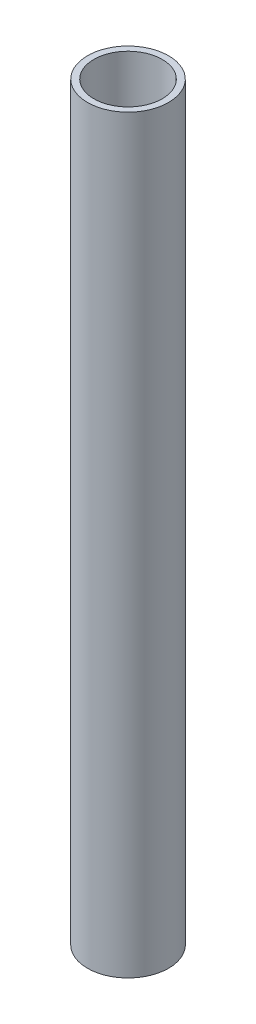
ISO-10303-21;
HEADER;
FILE_DESCRIPTION(('STEP AP214'),'2;1');
FILE_NAME('part.step','',(''),(''),'','','');
FILE_SCHEMA(('AUTOMOTIVE_DESIGN { 1 0 10303 214 1 1 1 1 }'));
ENDSEC;
DATA;
#1=APPLICATION_CONTEXT('core data for automotive mechanical design processes');
#2=APPLICATION_PROTOCOL_DEFINITION('international standard','automotive_design',2000,#1);
#3=PRODUCT_CONTEXT('',#1,'mechanical');
#4=PRODUCT('Part','Part','',(#3));
#5=PRODUCT_RELATED_PRODUCT_CATEGORY('part','',(#4));
#6=PRODUCT_DEFINITION_FORMATION('','',#4);
#7=PRODUCT_DEFINITION_CONTEXT('part definition',#1,'design');
#8=PRODUCT_DEFINITION('design','',#6,#7);
#9=PRODUCT_DEFINITION_SHAPE('','',#8);
#10=(LENGTH_UNIT() NAMED_UNIT(*) SI_UNIT(.MILLI.,.METRE.));
#11=(NAMED_UNIT(*) PLANE_ANGLE_UNIT() SI_UNIT($,.RADIAN.));
#12=(NAMED_UNIT(*) SI_UNIT($,.STERADIAN.) SOLID_ANGLE_UNIT());
#13=UNCERTAINTY_MEASURE_WITH_UNIT(LENGTH_MEASURE(1.E-05),#10,'distance_accuracy_value','');
#14=(GEOMETRIC_REPRESENTATION_CONTEXT(3) GLOBAL_UNCERTAINTY_ASSIGNED_CONTEXT((#13)) GLOBAL_UNIT_ASSIGNED_CONTEXT((#10,
#11,#12)) REPRESENTATION_CONTEXT('',''));
#15=CARTESIAN_POINT('',(0.,0.,0.));
#16=DIRECTION('',(0.,0.,1.));
#17=DIRECTION('',(1.,0.,0.));
#18=AXIS2_PLACEMENT_3D('',#15,#16,#17);
#19=CARTESIAN_POINT('',(-3.35359457523393E-13,329.664587481053,789.774999999999));
#20=DIRECTION('',(0.,1.,0.));
#21=DIRECTION('',(-1.,0.,0.));
#22=AXIS2_PLACEMENT_3D('',#19,#20,#21);
#23=PLANE('',#22);
#24=CARTESIAN_POINT('',(-3.35359457523393E-13,329.664587481053,789.774999999999));
#25=DIRECTION('',(0.,1.,0.));
#26=DIRECTION('',(-1.,0.,0.));
#27=AXIS2_PLACEMENT_3D('',#24,#25,#26);
#28=CIRCLE('',#27,7.93750000000001);
#29=CARTESIAN_POINT('',(7.93749999999968,329.664587481053,789.774999999999));
#30=VERTEX_POINT('',#29);
#31=EDGE_CURVE('E10',#30,#30,#28,.T.);
#32=ORIENTED_EDGE('',*,*,#31,.T.);
#33=EDGE_LOOP('',(#32));
#34=FACE_BOUND('',#33,.T.);
#35=CARTESIAN_POINT('',(-3.35359457523393E-13,329.664587481053,789.774999999999));
#36=DIRECTION('',(0.,1.,0.));
#37=DIRECTION('',(-1.,0.,0.));
#38=AXIS2_PLACEMENT_3D('',#35,#36,#37);
#39=CIRCLE('',#38,6.6929);
#40=CARTESIAN_POINT('',(6.69289999999967,329.664587481053,789.774999999999));
#41=VERTEX_POINT('',#40);
#42=EDGE_CURVE('E48',#41,#41,#39,.T.);
#43=ORIENTED_EDGE('',*,*,#42,.F.);
#44=EDGE_LOOP('',(#43));
#45=FACE_BOUND('',#44,.T.);
#46=ADVANCED_FACE('F37',(#34,#45),#23,.T.);
#47=CARTESIAN_POINT('',(0.,182.79,789.774999999999));
#48=DIRECTION('',(0.,1.,0.));
#49=DIRECTION('',(-1.,0.,0.));
#50=AXIS2_PLACEMENT_3D('',#47,#48,#49);
#51=PLANE('',#50);
#52=CARTESIAN_POINT('',(0.,182.79,789.774999999999));
#53=DIRECTION('',(0.,1.,0.));
#54=DIRECTION('',(-1.,0.,0.));
#55=AXIS2_PLACEMENT_3D('',#52,#53,#54);
#56=CIRCLE('',#55,7.93750000000001);
#57=CARTESIAN_POINT('',(7.93750000000003,182.79,789.774999999999));
#58=VERTEX_POINT('',#57);
#59=EDGE_CURVE('E41',#58,#58,#56,.T.);
#60=ORIENTED_EDGE('',*,*,#59,.F.);
#61=EDGE_LOOP('',(#60));
#62=FACE_BOUND('',#61,.T.);
#63=CARTESIAN_POINT('',(0.,182.79,789.774999999999));
#64=DIRECTION('',(0.,1.,0.));
#65=DIRECTION('',(-1.,0.,0.));
#66=AXIS2_PLACEMENT_3D('',#63,#64,#65);
#67=CIRCLE('',#66,6.6929);
#68=CARTESIAN_POINT('',(6.69290000000001,182.79,789.774999999999));
#69=VERTEX_POINT('',#68);
#70=EDGE_CURVE('E50',#69,#69,#67,.T.);
#71=ORIENTED_EDGE('',*,*,#70,.T.);
#72=EDGE_LOOP('',(#71));
#73=FACE_BOUND('',#72,.T.);
#74=ADVANCED_FACE('F60',(#62,#73),#51,.F.);
#75=CARTESIAN_POINT('',(-3.35359457523393E-13,329.664587481053,789.774999999999));
#76=DIRECTION('',(0.,-1.,0.));
#77=DIRECTION('',(1.,0.,0.));
#78=AXIS2_PLACEMENT_3D('',#75,#76,#77);
#79=CYLINDRICAL_SURFACE('',#78,7.93750000000001);
#80=CARTESIAN_POINT('',(7.93749999999968,329.664587481053,789.774999999999));
#81=CARTESIAN_POINT('',(7.93749999999968,328.134643861459,789.774999999999));
#82=CARTESIAN_POINT('',(7.93749999999969,326.604700241864,789.774999999999));
#83=CARTESIAN_POINT('',(7.93749999999969,323.544813002676,789.774999999999));
#84=CARTESIAN_POINT('',(7.9374999999997,322.014869383081,789.774999999999));
#85=CARTESIAN_POINT('',(7.9374999999997,318.954982143893,789.774999999999));
#86=CARTESIAN_POINT('',(7.93749999999971,317.425038524298,789.774999999999));
#87=CARTESIAN_POINT('',(7.93749999999972,314.36515128511,789.774999999999));
#88=CARTESIAN_POINT('',(7.93749999999972,312.835207665516,789.774999999999));
#89=CARTESIAN_POINT('',(7.93749999999973,309.775320426327,789.774999999999));
#90=CARTESIAN_POINT('',(7.93749999999973,308.245376806733,789.774999999999));
#91=CARTESIAN_POINT('',(7.93749999999974,305.185489567544,789.774999999999));
#92=CARTESIAN_POINT('',(7.93749999999974,303.65554594795,789.774999999999));
#93=CARTESIAN_POINT('',(7.93749999999975,300.595658708761,789.774999999999));
#94=CARTESIAN_POINT('',(7.93749999999975,299.065715089167,789.774999999999));
#95=CARTESIAN_POINT('',(7.93749999999976,296.005827849978,789.774999999999));
#96=CARTESIAN_POINT('',(7.93749999999976,294.475884230384,789.774999999999));
#97=CARTESIAN_POINT('',(7.93749999999977,291.415996991195,789.774999999999));
#98=CARTESIAN_POINT('',(7.93749999999977,289.886053371601,789.774999999999));
#99=CARTESIAN_POINT('',(7.93749999999978,286.826166132412,789.774999999999));
#100=CARTESIAN_POINT('',(7.93749999999978,285.296222512818,789.774999999999));
#101=CARTESIAN_POINT('',(7.93749999999979,282.23633527363,789.774999999999));
#102=CARTESIAN_POINT('',(7.9374999999998,280.706391654035,789.774999999999));
#103=CARTESIAN_POINT('',(7.9374999999998,277.646504414847,789.774999999999));
#104=CARTESIAN_POINT('',(7.93749999999981,276.116560795252,789.774999999999));
#105=CARTESIAN_POINT('',(7.93749999999981,273.056673556064,789.774999999999));
#106=CARTESIAN_POINT('',(7.93749999999982,271.526729936469,789.774999999999));
#107=CARTESIAN_POINT('',(7.93749999999982,268.466842697281,789.774999999999));
#108=CARTESIAN_POINT('',(7.93749999999983,266.936899077687,789.774999999999));
#109=CARTESIAN_POINT('',(7.93749999999983,263.877011838498,789.774999999999));
#110=CARTESIAN_POINT('',(7.93749999999984,262.347068218904,789.774999999999));
#111=CARTESIAN_POINT('',(7.93749999999985,259.287180979715,789.774999999999));
#112=CARTESIAN_POINT('',(7.93749999999985,257.757237360121,789.774999999999));
#113=CARTESIAN_POINT('',(7.93749999999986,254.697350120932,789.774999999999));
#114=CARTESIAN_POINT('',(7.93749999999986,253.167406501338,789.774999999999));
#115=CARTESIAN_POINT('',(7.93749999999987,250.107519262149,789.774999999999));
#116=CARTESIAN_POINT('',(7.93749999999987,248.577575642555,789.774999999999));
#117=CARTESIAN_POINT('',(7.93749999999988,245.517688403366,789.774999999999));
#118=CARTESIAN_POINT('',(7.93749999999988,243.987744783772,789.774999999999));
#119=CARTESIAN_POINT('',(7.93749999999989,240.927857544583,789.774999999999));
#120=CARTESIAN_POINT('',(7.93749999999989,239.397913924989,789.774999999999));
#121=CARTESIAN_POINT('',(7.9374999999999,236.338026685801,789.774999999999));
#122=CARTESIAN_POINT('',(7.9374999999999,234.808083066206,789.774999999999));
#123=CARTESIAN_POINT('',(7.93749999999991,231.748195827018,789.774999999999));
#124=CARTESIAN_POINT('',(7.93749999999991,230.218252207423,789.774999999999));
#125=CARTESIAN_POINT('',(7.93749999999992,227.158364968235,789.774999999999));
#126=CARTESIAN_POINT('',(7.93749999999993,225.62842134864,789.774999999999));
#127=CARTESIAN_POINT('',(7.93749999999993,222.568534109452,789.774999999999));
#128=CARTESIAN_POINT('',(7.93749999999994,221.038590489858,789.774999999999));
#129=CARTESIAN_POINT('',(7.93749999999994,217.978703250669,789.774999999999));
#130=CARTESIAN_POINT('',(7.93749999999995,216.448759631075,789.774999999999));
#131=CARTESIAN_POINT('',(7.93749999999995,213.388872391886,789.774999999999));
#132=CARTESIAN_POINT('',(7.93749999999996,211.858928772292,789.774999999999));
#133=CARTESIAN_POINT('',(7.93749999999996,208.799041533103,789.774999999999));
#134=CARTESIAN_POINT('',(7.93749999999997,207.269097913509,789.774999999999));
#135=CARTESIAN_POINT('',(7.93749999999997,204.20921067432,789.774999999999));
#136=CARTESIAN_POINT('',(7.93749999999998,202.679267054726,789.774999999999));
#137=CARTESIAN_POINT('',(7.93749999999999,199.619379815537,789.774999999999));
#138=CARTESIAN_POINT('',(7.93749999999999,198.089436195943,789.774999999999));
#139=CARTESIAN_POINT('',(7.9375,195.029548956754,789.774999999999));
#140=CARTESIAN_POINT('',(7.9375,193.49960533716,789.774999999999));
#141=CARTESIAN_POINT('',(7.93750000000001,190.439718097972,789.774999999999));
#142=CARTESIAN_POINT('',(7.93750000000001,188.909774478377,789.774999999999));
#143=CARTESIAN_POINT('',(7.93750000000002,185.849887239189,789.774999999999));
#144=CARTESIAN_POINT('',(7.93750000000002,184.319943619594,789.774999999999));
#145=CARTESIAN_POINT('',(7.93750000000003,182.79,789.774999999999));
#146=B_SPLINE_CURVE_WITH_KNOTS('',3,(#80,#81,#82,#83,#84,#85,#86,#87,#88,#89,#90,#91,#92,#93,
#94,#95,#96,#97,#98,#99,#100,#101,#102,#103,#104,#105,#106,#107,#108,#109,#110,#111,#112,#113,
#114,#115,#116,#117,#118,#119,#120,#121,#122,#123,#124,#125,#126,#127,#128,#129,#130,#131,#132,
#133,#134,#135,#136,#137,#138,#139,#140,#141,#142,#143,#144,#145),.UNSPECIFIED.,.F.,.F.,(4,2,2,
2,2,2,2,2,2,2,2,2,2,2,2,2,2,2,2,2,2,2,2,2,2,2,2,2,2,2,2,2,4),(0.,4.58983085878295,
9.17966171756585,13.7694925763487,18.3593234351316,22.9491542939145,27.5389851526974,
32.1288160114804,36.7186468702633,41.3084777290462,45.8983085878291,50.488139446612,
55.0779703053948,59.6678011641778,64.2576320229607,68.8474628817436,73.4372937405265,
78.0271245993094,82.6169554580923,87.2067863168752,91.7966171756581,96.386448034441,
100.976278893224,105.566109752007,110.15594061079,114.745771469573,119.335602328356,
123.925433187138,128.515264045921,133.105094904704,137.694925763487,142.28475662227,
146.874587481053),.UNSPECIFIED.);
#147=EDGE_CURVE('BSEAM39',#30,#58,#146,.T.);
#148=ORIENTED_EDGE('',*,*,#31,.F.);
#149=ORIENTED_EDGE('',*,*,#59,.T.);
#150=ORIENTED_EDGE('',*,*,#147,.T.);
#151=ORIENTED_EDGE('',*,*,#147,.F.);
#152=EDGE_LOOP('',(#148,#150,#149,#151));
#153=FACE_BOUND('',#152,.T.);
#154=ADVANCED_FACE('F39',(#153),#79,.T.);
#155=CARTESIAN_POINT('',(-3.35359457523393E-13,329.664587481053,789.774999999999));
#156=DIRECTION('',(0.,-1.,0.));
#157=DIRECTION('',(1.,0.,0.));
#158=AXIS2_PLACEMENT_3D('',#155,#156,#157);
#159=CYLINDRICAL_SURFACE('',#158,6.6929);
#160=CARTESIAN_POINT('',(6.69289999999967,329.664587481053,789.774999999999));
#161=CARTESIAN_POINT('',(6.69289999999967,328.134643861459,789.774999999999));
#162=CARTESIAN_POINT('',(6.69289999999968,326.604700241864,789.774999999999));
#163=CARTESIAN_POINT('',(6.69289999999968,323.544813002676,789.774999999999));
#164=CARTESIAN_POINT('',(6.69289999999969,322.014869383081,789.774999999999));
#165=CARTESIAN_POINT('',(6.69289999999969,318.954982143893,789.774999999999));
#166=CARTESIAN_POINT('',(6.6928999999997,317.425038524298,789.774999999999));
#167=CARTESIAN_POINT('',(6.6928999999997,314.36515128511,789.774999999999));
#168=CARTESIAN_POINT('',(6.69289999999971,312.835207665516,789.774999999999));
#169=CARTESIAN_POINT('',(6.69289999999972,309.775320426327,789.774999999999));
#170=CARTESIAN_POINT('',(6.69289999999972,308.245376806733,789.774999999999));
#171=CARTESIAN_POINT('',(6.69289999999973,305.185489567544,789.774999999999));
#172=CARTESIAN_POINT('',(6.69289999999973,303.65554594795,789.774999999999));
#173=CARTESIAN_POINT('',(6.69289999999974,300.595658708761,789.774999999999));
#174=CARTESIAN_POINT('',(6.69289999999974,299.065715089167,789.774999999999));
#175=CARTESIAN_POINT('',(6.69289999999975,296.005827849978,789.774999999999));
#176=CARTESIAN_POINT('',(6.69289999999975,294.475884230384,789.774999999999));
#177=CARTESIAN_POINT('',(6.69289999999976,291.415996991195,789.774999999999));
#178=CARTESIAN_POINT('',(6.69289999999976,289.886053371601,789.774999999999));
#179=CARTESIAN_POINT('',(6.69289999999977,286.826166132412,789.774999999999));
#180=CARTESIAN_POINT('',(6.69289999999977,285.296222512818,789.774999999999));
#181=CARTESIAN_POINT('',(6.69289999999978,282.23633527363,789.774999999999));
#182=CARTESIAN_POINT('',(6.69289999999978,280.706391654035,789.774999999999));
#183=CARTESIAN_POINT('',(6.69289999999979,277.646504414847,789.774999999999));
#184=CARTESIAN_POINT('',(6.6928999999998,276.116560795252,789.774999999999));
#185=CARTESIAN_POINT('',(6.6928999999998,273.056673556064,789.774999999999));
#186=CARTESIAN_POINT('',(6.69289999999981,271.526729936469,789.774999999999));
#187=CARTESIAN_POINT('',(6.69289999999981,268.466842697281,789.774999999999));
#188=CARTESIAN_POINT('',(6.69289999999982,266.936899077687,789.774999999999));
#189=CARTESIAN_POINT('',(6.69289999999982,263.877011838498,789.774999999999));
#190=CARTESIAN_POINT('',(6.69289999999983,262.347068218904,789.774999999999));
#191=CARTESIAN_POINT('',(6.69289999999983,259.287180979715,789.774999999999));
#192=CARTESIAN_POINT('',(6.69289999999984,257.757237360121,789.774999999999));
#193=CARTESIAN_POINT('',(6.69289999999985,254.697350120932,789.774999999999));
#194=CARTESIAN_POINT('',(6.69289999999985,253.167406501338,789.774999999999));
#195=CARTESIAN_POINT('',(6.69289999999986,250.107519262149,789.774999999999));
#196=CARTESIAN_POINT('',(6.69289999999986,248.577575642555,789.774999999999));
#197=CARTESIAN_POINT('',(6.69289999999987,245.517688403366,789.774999999999));
#198=CARTESIAN_POINT('',(6.69289999999987,243.987744783772,789.774999999999));
#199=CARTESIAN_POINT('',(6.69289999999988,240.927857544583,789.774999999999));
#200=CARTESIAN_POINT('',(6.69289999999988,239.397913924989,789.774999999999));
#201=CARTESIAN_POINT('',(6.69289999999989,236.338026685801,789.774999999999));
#202=CARTESIAN_POINT('',(6.69289999999989,234.808083066206,789.774999999999));
#203=CARTESIAN_POINT('',(6.6928999999999,231.748195827018,789.774999999999));
#204=CARTESIAN_POINT('',(6.6928999999999,230.218252207423,789.774999999999));
#205=CARTESIAN_POINT('',(6.69289999999991,227.158364968235,789.774999999999));
#206=CARTESIAN_POINT('',(6.69289999999991,225.62842134864,789.774999999999));
#207=CARTESIAN_POINT('',(6.69289999999992,222.568534109452,789.774999999999));
#208=CARTESIAN_POINT('',(6.69289999999992,221.038590489858,789.774999999999));
#209=CARTESIAN_POINT('',(6.69289999999993,217.978703250669,789.774999999999));
#210=CARTESIAN_POINT('',(6.69289999999994,216.448759631075,789.774999999999));
#211=CARTESIAN_POINT('',(6.69289999999994,213.388872391886,789.774999999999));
#212=CARTESIAN_POINT('',(6.69289999999995,211.858928772292,789.774999999999));
#213=CARTESIAN_POINT('',(6.69289999999995,208.799041533103,789.774999999999));
#214=CARTESIAN_POINT('',(6.69289999999996,207.269097913509,789.774999999999));
#215=CARTESIAN_POINT('',(6.69289999999996,204.20921067432,789.774999999999));
#216=CARTESIAN_POINT('',(6.69289999999997,202.679267054726,789.774999999999));
#217=CARTESIAN_POINT('',(6.69289999999997,199.619379815537,789.774999999999));
#218=CARTESIAN_POINT('',(6.69289999999998,198.089436195943,789.774999999999));
#219=CARTESIAN_POINT('',(6.69289999999999,195.029548956754,789.774999999999));
#220=CARTESIAN_POINT('',(6.69289999999999,193.49960533716,789.774999999999));
#221=CARTESIAN_POINT('',(6.6929,190.439718097972,789.774999999999));
#222=CARTESIAN_POINT('',(6.6929,188.909774478377,789.774999999999));
#223=CARTESIAN_POINT('',(6.69290000000001,185.849887239189,789.774999999999));
#224=CARTESIAN_POINT('',(6.69290000000001,184.319943619594,789.774999999999));
#225=CARTESIAN_POINT('',(6.69290000000001,182.79,789.774999999999));
#226=B_SPLINE_CURVE_WITH_KNOTS('',3,(#160,#161,#162,#163,#164,#165,#166,#167,#168,#169,#170,
#171,#172,#173,#174,#175,#176,#177,#178,#179,#180,#181,#182,#183,#184,#185,#186,#187,#188,#189,
#190,#191,#192,#193,#194,#195,#196,#197,#198,#199,#200,#201,#202,#203,#204,#205,#206,#207,#208,
#209,#210,#211,#212,#213,#214,#215,#216,#217,#218,#219,#220,#221,#222,#223,#224,#225),
.UNSPECIFIED.,.F.,.F.,(4,2,2,2,2,2,2,2,2,2,2,2,2,2,2,2,2,2,2,2,2,2,2,2,2,2,2,2,2,2,2,2,4),(0.,
4.58983085878289,9.17966171756579,13.7694925763487,18.3593234351316,22.9491542939145,
27.5389851526974,32.1288160114803,36.7186468702632,41.3084777290461,45.898308587829,
50.4881394466119,55.0779703053948,59.6678011641777,64.2576320229606,68.8474628817435,
73.4372937405264,78.0271245993093,82.6169554580922,87.2067863168751,91.7966171756581,
96.386448034441,100.976278893224,105.566109752007,110.15594061079,114.745771469573,
119.335602328355,123.925433187138,128.515264045921,133.105094904704,137.694925763487,
142.28475662227,146.874587481053),.UNSPECIFIED.);
#227=EDGE_CURVE('BSEAM56',#41,#69,#226,.T.);
#228=ORIENTED_EDGE('',*,*,#42,.T.);
#229=ORIENTED_EDGE('',*,*,#70,.F.);
#230=ORIENTED_EDGE('',*,*,#227,.T.);
#231=ORIENTED_EDGE('',*,*,#227,.F.);
#232=EDGE_LOOP('',(#228,#230,#229,#231));
#233=FACE_BOUND('',#232,.T.);
#234=ADVANCED_FACE('F56',(#233),#159,.F.);
#235=CLOSED_SHELL('',(#46,#74,#154,#234));
#236=MANIFOLD_SOLID_BREP('B2',#235);
#237=ADVANCED_BREP_SHAPE_REPRESENTATION('',(#18,#236),#14);
#238=SHAPE_DEFINITION_REPRESENTATION(#9,#237);
ENDSEC;
END-ISO-10303-21;
